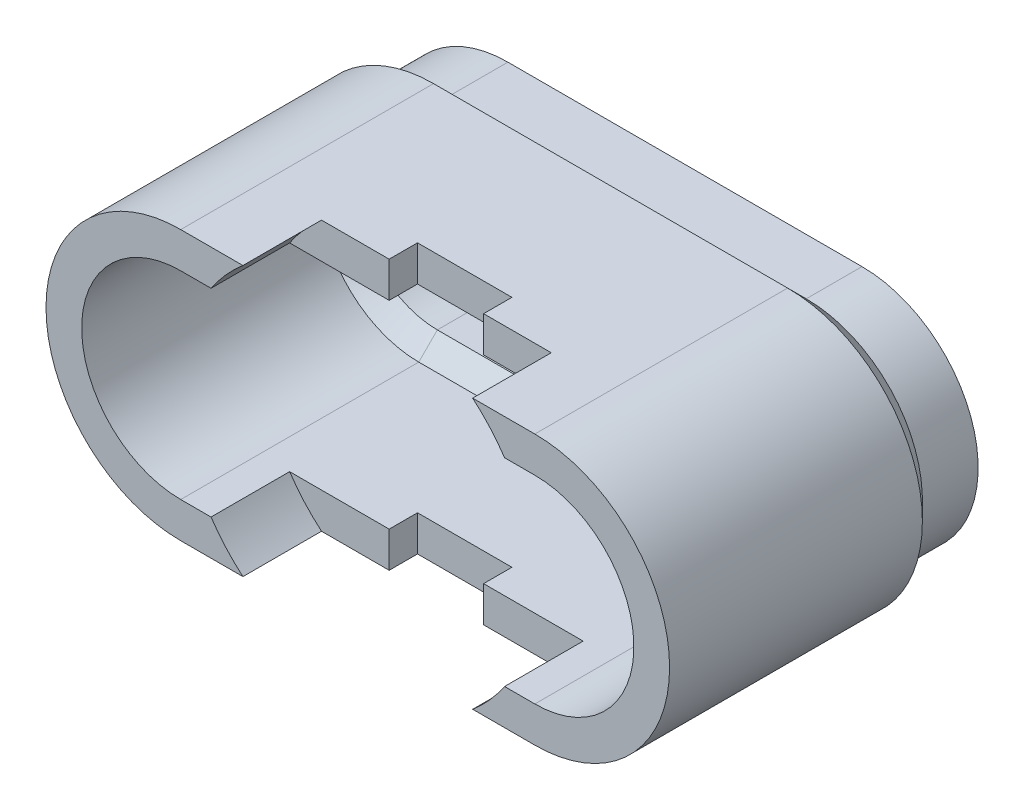
ISO-10303-21;
HEADER;
FILE_DESCRIPTION(('STEP AP214'),'2;1');
FILE_NAME('part.step','',(''),(''),'','','');
FILE_SCHEMA(('AUTOMOTIVE_DESIGN { 1 0 10303 214 1 1 1 1 }'));
ENDSEC;
DATA;
#1=APPLICATION_CONTEXT('core data for automotive mechanical design processes');
#2=APPLICATION_PROTOCOL_DEFINITION('international standard','automotive_design',2000,#1);
#3=PRODUCT_CONTEXT('',#1,'mechanical');
#4=PRODUCT('Part','Part','',(#3));
#5=PRODUCT_RELATED_PRODUCT_CATEGORY('part','',(#4));
#6=PRODUCT_DEFINITION_FORMATION('','',#4);
#7=PRODUCT_DEFINITION_CONTEXT('part definition',#1,'design');
#8=PRODUCT_DEFINITION('design','',#6,#7);
#9=PRODUCT_DEFINITION_SHAPE('','',#8);
#10=(LENGTH_UNIT() NAMED_UNIT(*) SI_UNIT(.MILLI.,.METRE.));
#11=(NAMED_UNIT(*) PLANE_ANGLE_UNIT() SI_UNIT($,.RADIAN.));
#12=(NAMED_UNIT(*) SI_UNIT($,.STERADIAN.) SOLID_ANGLE_UNIT());
#13=UNCERTAINTY_MEASURE_WITH_UNIT(LENGTH_MEASURE(1.E-05),#10,'distance_accuracy_value','');
#14=(GEOMETRIC_REPRESENTATION_CONTEXT(3) GLOBAL_UNCERTAINTY_ASSIGNED_CONTEXT((#13)) GLOBAL_UNIT_ASSIGNED_CONTEXT((#10,
#11,#12)) REPRESENTATION_CONTEXT('',''));
#15=CARTESIAN_POINT('',(0.,0.,0.));
#16=DIRECTION('',(0.,0.,1.));
#17=DIRECTION('',(1.,0.,0.));
#18=AXIS2_PLACEMENT_3D('',#15,#16,#17);
#19=CARTESIAN_POINT('',(0.,0.,5.18587753126935));
#20=DIRECTION('',(0.,0.,-1.));
#21=DIRECTION('',(-1.,0.,0.));
#22=AXIS2_PLACEMENT_3D('',#19,#20,#21);
#23=PLANE('',#22);
#24=DIRECTION('',(-1.,0.,0.));
#25=VECTOR('',#24,1.);
#26=CARTESIAN_POINT('',(-4.76249999999986,-3.6242,5.18587753126932));
#27=LINE('',#26,#25);
#28=CARTESIAN_POINT('',(-1.27000000000004,-3.6242,5.18587753126935));
#29=VERTEX_POINT('',#28);
#30=CARTESIAN_POINT('',(-3.08975413423138,-3.6242,5.18587753126933));
#31=VERTEX_POINT('',#30);
#32=EDGE_CURVE('E322',#29,#31,#27,.T.);
#33=ORIENTED_EDGE('',*,*,#32,.F.);
#34=DIRECTION('',(0.,-1.,0.));
#35=VECTOR('',#34,1.);
#36=CARTESIAN_POINT('',(-1.27000000000004,3.62419999999999,5.18587753126935));
#37=LINE('',#36,#35);
#38=CARTESIAN_POINT('',(-1.27000000000004,-2.6642,5.18587753126935));
#39=VERTEX_POINT('',#38);
#40=EDGE_CURVE('E258',#39,#29,#37,.T.);
#41=ORIENTED_EDGE('',*,*,#40,.F.);
#42=DIRECTION('',(-1.,0.,0.));
#43=VECTOR('',#42,1.);
#44=CARTESIAN_POINT('',(-4.76249999999986,-2.6642,5.18587753126932));
#45=LINE('',#44,#43);
#46=CARTESIAN_POINT('',(-3.94758718839747,-2.6642,5.18587753126932));
#47=VERTEX_POINT('',#46);
#48=EDGE_CURVE('E495',#39,#47,#45,.T.);
#49=ORIENTED_EDGE('',*,*,#48,.T.);
#50=CARTESIAN_POINT('',(0.,0.,5.18587753126935));
#51=DIRECTION('',(0.,0.,-1.));
#52=DIRECTION('',(-1.,0.,0.));
#53=AXIS2_PLACEMENT_3D('',#50,#51,#52);
#54=CIRCLE('',#53,4.7625);
#55=EDGE_CURVE('E305',#31,#47,#54,.T.);
#56=ORIENTED_EDGE('',*,*,#55,.F.);
#57=EDGE_LOOP('',(#33,#41,#49,#56));
#58=FACE_BOUND('',#57,.T.);
#59=ADVANCED_FACE('F33',(#58),#23,.F.);
#60=DIRECTION('',(1.,0.,0.));
#61=VECTOR('',#60,1.);
#62=CARTESIAN_POINT('',(4.76250000000014,2.6642,5.18587753126939));
#63=LINE('',#62,#61);
#64=CARTESIAN_POINT('',(-3.94758718839748,2.66419999999999,5.18587753126932));
#65=VERTEX_POINT('',#64);
#66=CARTESIAN_POINT('',(-1.27000000000004,2.66419999999999,5.18587753126935));
#67=VERTEX_POINT('',#66);
#68=EDGE_CURVE('E319',#65,#67,#63,.T.);
#69=ORIENTED_EDGE('',*,*,#68,.T.);
#70=CARTESIAN_POINT('',(-1.27000000000004,3.62419999999999,5.18587753126935));
#71=VERTEX_POINT('',#70);
#72=EDGE_CURVE('E273',#71,#67,#37,.T.);
#73=ORIENTED_EDGE('',*,*,#72,.F.);
#74=DIRECTION('',(1.,0.,0.));
#75=VECTOR('',#74,1.);
#76=CARTESIAN_POINT('',(4.76250000000014,3.6242,5.18587753126939));
#77=LINE('',#76,#75);
#78=CARTESIAN_POINT('',(-3.08975413423139,3.62419999999999,5.18587753126933));
#79=VERTEX_POINT('',#78);
#80=EDGE_CURVE('E326',#79,#71,#77,.T.);
#81=ORIENTED_EDGE('',*,*,#80,.F.);
#82=CARTESIAN_POINT('',(0.,0.,5.18587753126935));
#83=DIRECTION('',(0.,0.,-1.));
#84=DIRECTION('',(-1.,0.,0.));
#85=AXIS2_PLACEMENT_3D('',#82,#83,#84);
#86=CIRCLE('',#85,4.7625);
#87=EDGE_CURVE('E302',#65,#79,#86,.T.);
#88=ORIENTED_EDGE('',*,*,#87,.F.);
#89=EDGE_LOOP('',(#69,#73,#81,#88));
#90=FACE_BOUND('',#89,.T.);
#91=ADVANCED_FACE('F539',(#90),#23,.F.);
#92=CARTESIAN_POINT('',(0.,14.415499957,7.3));
#93=DIRECTION('',(0.,0.,-1.));
#94=DIRECTION('',(-1.,0.,0.));
#95=AXIS2_PLACEMENT_3D('',#92,#93,#94);
#96=PLANE('',#95);
#97=DIRECTION('',(1.,0.,0.));
#98=VECTOR('',#97,1.);
#99=CARTESIAN_POINT('',(4.76250000000013,2.6642,7.30000000000004));
#100=LINE('',#99,#98);
#101=CARTESIAN_POINT('',(-4.7625,2.6642,7.29999999999998));
#102=VERTEX_POINT('',#101);
#103=CARTESIAN_POINT('',(-3.94758718839749,2.6642,7.3));
#104=VERTEX_POINT('',#103);
#105=EDGE_CURVE('E403',#102,#104,#100,.T.);
#106=ORIENTED_EDGE('',*,*,#105,.T.);
#107=CARTESIAN_POINT('',(0.,0.,7.3));
#108=DIRECTION('',(0.,0.,1.));
#109=DIRECTION('',(1.,0.,0.));
#110=AXIS2_PLACEMENT_3D('',#107,#108,#109);
#111=CIRCLE('',#110,4.76250000000001);
#112=CARTESIAN_POINT('',(-3.0897541342314,3.6242,7.3));
#113=VERTEX_POINT('',#112);
#114=EDGE_CURVE('E298',#113,#104,#111,.T.);
#115=ORIENTED_EDGE('',*,*,#114,.F.);
#116=DIRECTION('',(1.,0.,0.));
#117=VECTOR('',#116,1.);
#118=CARTESIAN_POINT('',(4.76250000000013,3.6242,7.30000000000004));
#119=LINE('',#118,#117);
#120=CARTESIAN_POINT('',(-4.7625,3.6242,7.29999999999997));
#121=VERTEX_POINT('',#120);
#122=EDGE_CURVE('E419',#121,#113,#119,.T.);
#123=ORIENTED_EDGE('',*,*,#122,.F.);
#124=CARTESIAN_POINT('',(-4.7625,0.,7.29999999999997));
#125=DIRECTION('',(0.,0.,-1.));
#126=DIRECTION('',(-1.,0.,0.));
#127=AXIS2_PLACEMENT_3D('',#124,#125,#126);
#128=CIRCLE('',#127,3.6242);
#129=CARTESIAN_POINT('',(-4.7625,-3.6242,7.29999999999997));
#130=VERTEX_POINT('',#129);
#131=EDGE_CURVE('E423',#130,#121,#128,.T.);
#132=ORIENTED_EDGE('',*,*,#131,.F.);
#133=DIRECTION('',(-1.,0.,0.));
#134=VECTOR('',#133,1.);
#135=CARTESIAN_POINT('',(-4.76249999999987,-3.6242,7.29999999999997));
#136=LINE('',#135,#134);
#137=CARTESIAN_POINT('',(-3.08975413423138,-3.6242,7.3));
#138=VERTEX_POINT('',#137);
#139=EDGE_CURVE('E418',#138,#130,#136,.T.);
#140=ORIENTED_EDGE('',*,*,#139,.F.);
#141=CARTESIAN_POINT('',(0.,0.,7.3));
#142=DIRECTION('',(0.,0.,1.));
#143=DIRECTION('',(1.,0.,0.));
#144=AXIS2_PLACEMENT_3D('',#141,#142,#143);
#145=CIRCLE('',#144,4.7625);
#146=CARTESIAN_POINT('',(-3.94758718839748,-2.6642,7.3));
#147=VERTEX_POINT('',#146);
#148=EDGE_CURVE('E296',#147,#138,#145,.T.);
#149=ORIENTED_EDGE('',*,*,#148,.F.);
#150=DIRECTION('',(-1.,0.,0.));
#151=VECTOR('',#150,1.);
#152=CARTESIAN_POINT('',(-4.76249999999987,-2.6642,7.29999999999997));
#153=LINE('',#152,#151);
#154=CARTESIAN_POINT('',(-4.7625,-2.6642,7.29999999999997));
#155=VERTEX_POINT('',#154);
#156=EDGE_CURVE('E412',#147,#155,#153,.T.);
#157=ORIENTED_EDGE('',*,*,#156,.T.);
#158=CARTESIAN_POINT('',(-4.7625,0.,7.29999999999997));
#159=DIRECTION('',(0.,0.,-1.));
#160=DIRECTION('',(-1.,0.,0.));
#161=AXIS2_PLACEMENT_3D('',#158,#159,#160);
#162=CIRCLE('',#161,2.6642);
#163=EDGE_CURVE('E374',#155,#102,#162,.T.);
#164=ORIENTED_EDGE('',*,*,#163,.T.);
#165=EDGE_LOOP('',(#106,#115,#123,#132,#140,#149,#157,#164));
#166=FACE_BOUND('',#165,.T.);
#167=ADVANCED_FACE('F546',(#166),#96,.F.);
#168=CARTESIAN_POINT('',(-4.7625,0.,-18.4659261497862));
#169=DIRECTION('',(0.,0.,1.));
#170=DIRECTION('',(1.,0.,0.));
#171=AXIS2_PLACEMENT_3D('',#168,#169,#170);
#172=CYLINDRICAL_SURFACE('',#171,3.1242);
#173=CARTESIAN_POINT('',(-4.7625,0.,-1.5));
#174=DIRECTION('',(0.,0.,1.));
#175=DIRECTION('',(1.,0.,0.));
#176=AXIS2_PLACEMENT_3D('',#173,#174,#175);
#177=CIRCLE('',#176,3.1242);
#178=CARTESIAN_POINT('',(-4.7625,-3.1242,-1.5));
#179=VERTEX_POINT('',#178);
#180=CARTESIAN_POINT('',(-4.7625,3.1242,-1.5));
#181=VERTEX_POINT('',#180);
#182=EDGE_CURVE('E470',#179,#181,#177,.F.);
#183=ORIENTED_EDGE('',*,*,#182,.F.);
#184=DIRECTION('',(0.,0.,1.));
#185=VECTOR('',#184,1.);
#186=CARTESIAN_POINT('',(-4.7625,-3.1242,-18.4659261497862));
#187=LINE('',#186,#185);
#188=CARTESIAN_POINT('',(-4.7625,-3.1242,0.));
#189=VERTEX_POINT('',#188);
#190=EDGE_CURVE('E484',#179,#189,#187,.T.);
#191=ORIENTED_EDGE('',*,*,#190,.T.);
#192=CARTESIAN_POINT('',(-4.7625,0.,0.));
#193=DIRECTION('',(0.,0.,1.));
#194=DIRECTION('',(1.,0.,0.));
#195=AXIS2_PLACEMENT_3D('',#192,#193,#194);
#196=CIRCLE('',#195,3.1242);
#197=CARTESIAN_POINT('',(-4.7625,3.1242,0.));
#198=VERTEX_POINT('',#197);
#199=EDGE_CURVE('E456',#198,#189,#196,.T.);
#200=ORIENTED_EDGE('',*,*,#199,.F.);
#201=DIRECTION('',(0.,0.,1.));
#202=VECTOR('',#201,1.);
#203=CARTESIAN_POINT('',(-4.7625,3.1242,-18.4659261497862));
#204=LINE('',#203,#202);
#205=EDGE_CURVE('E468',#181,#198,#204,.T.);
#206=ORIENTED_EDGE('',*,*,#205,.F.);
#207=EDGE_LOOP('',(#183,#191,#200,#206));
#208=FACE_BOUND('',#207,.T.);
#209=ADVANCED_FACE('F35',(#208),#172,.T.);
#210=CARTESIAN_POINT('',(4.7625,3.1242,-18.4659261497862));
#211=DIRECTION('',(0.,1.,0.));
#212=DIRECTION('',(-1.,0.,0.));
#213=AXIS2_PLACEMENT_3D('',#210,#211,#212);
#214=PLANE('',#213);
#215=DIRECTION('',(1.,0.,0.));
#216=VECTOR('',#215,1.);
#217=CARTESIAN_POINT('',(4.7625,3.1242,-1.5));
#218=LINE('',#217,#216);
#219=CARTESIAN_POINT('',(4.7625,3.1242,-1.5));
#220=VERTEX_POINT('',#219);
#221=EDGE_CURVE('E467',#181,#220,#218,.T.);
#222=ORIENTED_EDGE('',*,*,#221,.F.);
#223=ORIENTED_EDGE('',*,*,#205,.T.);
#224=DIRECTION('',(-1.,0.,0.));
#225=VECTOR('',#224,1.);
#226=CARTESIAN_POINT('',(4.7625,3.1242,0.));
#227=LINE('',#226,#225);
#228=CARTESIAN_POINT('',(4.7625,3.1242,0.));
#229=VERTEX_POINT('',#228);
#230=EDGE_CURVE('E481',#229,#198,#227,.T.);
#231=ORIENTED_EDGE('',*,*,#230,.F.);
#232=DIRECTION('',(0.,0.,1.));
#233=VECTOR('',#232,1.);
#234=CARTESIAN_POINT('',(4.7625,3.1242,-18.4659261497862));
#235=LINE('',#234,#233);
#236=EDGE_CURVE('E487',#220,#229,#235,.T.);
#237=ORIENTED_EDGE('',*,*,#236,.F.);
#238=EDGE_LOOP('',(#222,#223,#231,#237));
#239=FACE_BOUND('',#238,.T.);
#240=ADVANCED_FACE('F909',(#239),#214,.T.);
#241=CARTESIAN_POINT('',(4.7625,0.,-18.4659261497862));
#242=DIRECTION('',(0.,0.,1.));
#243=DIRECTION('',(1.,0.,0.));
#244=AXIS2_PLACEMENT_3D('',#241,#242,#243);
#245=CYLINDRICAL_SURFACE('',#244,3.1242);
#246=CARTESIAN_POINT('',(4.7625,0.,-1.5));
#247=DIRECTION('',(0.,0.,1.));
#248=DIRECTION('',(1.,0.,0.));
#249=AXIS2_PLACEMENT_3D('',#246,#247,#248);
#250=CIRCLE('',#249,3.1242);
#251=CARTESIAN_POINT('',(4.7625,-3.1242,-1.5));
#252=VERTEX_POINT('',#251);
#253=EDGE_CURVE('E465',#220,#252,#250,.F.);
#254=ORIENTED_EDGE('',*,*,#253,.F.);
#255=ORIENTED_EDGE('',*,*,#236,.T.);
#256=CARTESIAN_POINT('',(4.7625,0.,0.));
#257=DIRECTION('',(0.,0.,1.));
#258=DIRECTION('',(1.,0.,0.));
#259=AXIS2_PLACEMENT_3D('',#256,#257,#258);
#260=CIRCLE('',#259,3.1242);
#261=CARTESIAN_POINT('',(4.7625,-3.1242,0.));
#262=VERTEX_POINT('',#261);
#263=EDGE_CURVE('E478',#262,#229,#260,.T.);
#264=ORIENTED_EDGE('',*,*,#263,.F.);
#265=DIRECTION('',(0.,0.,1.));
#266=VECTOR('',#265,1.);
#267=CARTESIAN_POINT('',(4.7625,-3.1242,-18.4659261497862));
#268=LINE('',#267,#266);
#269=EDGE_CURVE('E489',#252,#262,#268,.T.);
#270=ORIENTED_EDGE('',*,*,#269,.F.);
#271=EDGE_LOOP('',(#254,#255,#264,#270));
#272=FACE_BOUND('',#271,.T.);
#273=ADVANCED_FACE('F901',(#272),#245,.T.);
#274=CARTESIAN_POINT('',(-4.7625,-3.1242,-18.4659261497862));
#275=DIRECTION('',(0.,-1.,0.));
#276=DIRECTION('',(0.,0.,-1.));
#277=AXIS2_PLACEMENT_3D('',#274,#275,#276);
#278=PLANE('',#277);
#279=DIRECTION('',(-1.,0.,0.));
#280=VECTOR('',#279,1.);
#281=CARTESIAN_POINT('',(-4.7625,-3.1242,-1.5));
#282=LINE('',#281,#280);
#283=EDGE_CURVE('E472',#252,#179,#282,.T.);
#284=ORIENTED_EDGE('',*,*,#283,.F.);
#285=ORIENTED_EDGE('',*,*,#269,.T.);
#286=DIRECTION('',(1.,0.,0.));
#287=VECTOR('',#286,1.);
#288=CARTESIAN_POINT('',(-4.7625,-3.1242,0.));
#289=LINE('',#288,#287);
#290=EDGE_CURVE('E475',#189,#262,#289,.T.);
#291=ORIENTED_EDGE('',*,*,#290,.F.);
#292=ORIENTED_EDGE('',*,*,#190,.F.);
#293=EDGE_LOOP('',(#284,#285,#291,#292));
#294=FACE_BOUND('',#293,.T.);
#295=ADVANCED_FACE('F892',(#294),#278,.T.);
#296=CARTESIAN_POINT('',(0.,14.415499957,-1.5));
#297=DIRECTION('',(0.,0.,1.));
#298=DIRECTION('',(1.,0.,0.));
#299=AXIS2_PLACEMENT_3D('',#296,#297,#298);
#300=PLANE('',#299);
#301=ORIENTED_EDGE('',*,*,#182,.T.);
#302=ORIENTED_EDGE('',*,*,#221,.T.);
#303=ORIENTED_EDGE('',*,*,#253,.T.);
#304=ORIENTED_EDGE('',*,*,#283,.T.);
#305=EDGE_LOOP('',(#301,#302,#303,#304));
#306=FACE_BOUND('',#305,.T.);
#307=ADVANCED_FACE('F882',(#306),#300,.F.);
#308=CARTESIAN_POINT('',(-4.7625,0.,0.));
#309=DIRECTION('',(0.,0.,1.));
#310=DIRECTION('',(1.,0.,0.));
#311=AXIS2_PLACEMENT_3D('',#308,#309,#310);
#312=CONICAL_SURFACE('',#311,3.1242,0.78539816339745);
#313=ORIENTED_EDGE('',*,*,#199,.T.);
#314=DIRECTION('',(0.,-0.707106781186549,0.707106781186546));
#315=VECTOR('',#314,1.);
#316=CARTESIAN_POINT('',(-4.7625,-3.1242,0.));
#317=LINE('',#316,#315);
#318=CARTESIAN_POINT('',(-4.7625,-3.6242,0.5));
#319=VERTEX_POINT('',#318);
#320=EDGE_CURVE('E453',#319,#189,#317,.F.);
#321=ORIENTED_EDGE('',*,*,#320,.F.);
#322=CARTESIAN_POINT('',(-4.7625,0.,0.5));
#323=DIRECTION('',(0.,0.,1.));
#324=DIRECTION('',(1.,0.,0.));
#325=AXIS2_PLACEMENT_3D('',#322,#323,#324);
#326=CIRCLE('',#325,3.6242);
#327=CARTESIAN_POINT('',(-4.7625,3.6242,0.5));
#328=VERTEX_POINT('',#327);
#329=EDGE_CURVE('E426',#328,#319,#326,.T.);
#330=ORIENTED_EDGE('',*,*,#329,.F.);
#331=DIRECTION('',(0.,0.707106781186549,0.707106781186546));
#332=VECTOR('',#331,1.);
#333=CARTESIAN_POINT('',(-4.7625,3.1242,0.));
#334=LINE('',#333,#332);
#335=EDGE_CURVE('E452',#328,#198,#334,.F.);
#336=ORIENTED_EDGE('',*,*,#335,.T.);
#337=EDGE_LOOP('',(#313,#321,#330,#336));
#338=FACE_BOUND('',#337,.T.);
#339=ADVANCED_FACE('F873',(#338),#312,.T.);
#340=CARTESIAN_POINT('',(-4.7625,-3.1242,0.));
#341=DIRECTION('',(0.,-0.707106781186546,-0.707106781186549));
#342=DIRECTION('',(0.,0.707106781186549,-0.707106781186546));
#343=AXIS2_PLACEMENT_3D('',#340,#341,#342);
#344=PLANE('',#343);
#345=ORIENTED_EDGE('',*,*,#290,.T.);
#346=DIRECTION('',(0.,-0.707106781186549,0.707106781186546));
#347=VECTOR('',#346,1.);
#348=CARTESIAN_POINT('',(4.7625,-3.1242,0.));
#349=LINE('',#348,#347);
#350=CARTESIAN_POINT('',(4.7625,-3.6242,0.5));
#351=VERTEX_POINT('',#350);
#352=EDGE_CURVE('E457',#351,#262,#349,.F.);
#353=ORIENTED_EDGE('',*,*,#352,.F.);
#354=DIRECTION('',(-1.,0.,0.));
#355=VECTOR('',#354,1.);
#356=CARTESIAN_POINT('',(-4.7625,-3.6242,0.5));
#357=LINE('',#356,#355);
#358=EDGE_CURVE('E443',#319,#351,#357,.F.);
#359=ORIENTED_EDGE('',*,*,#358,.F.);
#360=ORIENTED_EDGE('',*,*,#320,.T.);
#361=EDGE_LOOP('',(#345,#353,#359,#360));
#362=FACE_BOUND('',#361,.T.);
#363=ADVANCED_FACE('F864',(#362),#344,.T.);
#364=CARTESIAN_POINT('',(4.7625,0.,0.));
#365=DIRECTION('',(0.,0.,1.));
#366=DIRECTION('',(1.,0.,0.));
#367=AXIS2_PLACEMENT_3D('',#364,#365,#366);
#368=CONICAL_SURFACE('',#367,3.1242,0.78539816339745);
#369=ORIENTED_EDGE('',*,*,#263,.T.);
#370=DIRECTION('',(0.,0.707106781186549,0.707106781186546));
#371=VECTOR('',#370,1.);
#372=CARTESIAN_POINT('',(4.7625,3.1242,0.));
#373=LINE('',#372,#371);
#374=CARTESIAN_POINT('',(4.7625,3.6242,0.5));
#375=VERTEX_POINT('',#374);
#376=EDGE_CURVE('E460',#375,#229,#373,.F.);
#377=ORIENTED_EDGE('',*,*,#376,.F.);
#378=CARTESIAN_POINT('',(4.7625,0.,0.5));
#379=DIRECTION('',(0.,0.,1.));
#380=DIRECTION('',(1.,0.,0.));
#381=AXIS2_PLACEMENT_3D('',#378,#379,#380);
#382=CIRCLE('',#381,3.6242);
#383=EDGE_CURVE('E446',#351,#375,#382,.T.);
#384=ORIENTED_EDGE('',*,*,#383,.F.);
#385=ORIENTED_EDGE('',*,*,#352,.T.);
#386=EDGE_LOOP('',(#369,#377,#384,#385));
#387=FACE_BOUND('',#386,.T.);
#388=ADVANCED_FACE('F855',(#387),#368,.T.);
#389=CARTESIAN_POINT('',(4.7625,3.1242,0.));
#390=DIRECTION('',(0.,0.707106781186546,-0.707106781186549));
#391=DIRECTION('',(0.,0.707106781186549,0.707106781186546));
#392=AXIS2_PLACEMENT_3D('',#389,#390,#391);
#393=PLANE('',#392);
#394=ORIENTED_EDGE('',*,*,#230,.T.);
#395=ORIENTED_EDGE('',*,*,#335,.F.);
#396=DIRECTION('',(1.,0.,0.));
#397=VECTOR('',#396,1.);
#398=CARTESIAN_POINT('',(4.7625,3.6242,0.5));
#399=LINE('',#398,#397);
#400=EDGE_CURVE('E449',#375,#328,#399,.F.);
#401=ORIENTED_EDGE('',*,*,#400,.F.);
#402=ORIENTED_EDGE('',*,*,#376,.T.);
#403=EDGE_LOOP('',(#394,#395,#401,#402));
#404=FACE_BOUND('',#403,.T.);
#405=ADVANCED_FACE('F848',(#404),#393,.T.);
#406=CARTESIAN_POINT('',(4.7625,3.6242,25.572554559229));
#407=DIRECTION('',(0.,-1.,0.));
#408=DIRECTION('',(1.,0.,0.));
#409=AXIS2_PLACEMENT_3D('',#406,#407,#408);
#410=PLANE('',#409);
#411=ORIENTED_EDGE('',*,*,#80,.T.);
#412=DIRECTION('',(0.,0.,1.));
#413=VECTOR('',#412,1.);
#414=CARTESIAN_POINT('',(-1.27000000000004,3.62419999999999,4.42387753126935));
#415=LINE('',#414,#413);
#416=CARTESIAN_POINT('',(-1.27000000000004,3.62419999999999,4.42387753126935));
#417=VERTEX_POINT('',#416);
#418=EDGE_CURVE('E276',#417,#71,#415,.T.);
#419=ORIENTED_EDGE('',*,*,#418,.F.);
#420=DIRECTION('',(-1.,0.,0.));
#421=VECTOR('',#420,1.);
#422=CARTESIAN_POINT('',(-1.27000000000004,3.62419999999999,4.42387753126935));
#423=LINE('',#422,#421);
#424=CARTESIAN_POINT('',(1.26999999999996,3.62419999999999,4.42387753126935));
#425=VERTEX_POINT('',#424);
#426=EDGE_CURVE('E261',#425,#417,#423,.T.);
#427=ORIENTED_EDGE('',*,*,#426,.F.);
#428=DIRECTION('',(0.,0.,1.));
#429=VECTOR('',#428,1.);
#430=CARTESIAN_POINT('',(1.26999999999996,3.62419999999999,4.42387753126935));
#431=LINE('',#430,#429);
#432=CARTESIAN_POINT('',(1.26999999999996,3.62419999999999,5.18587753126935));
#433=VERTEX_POINT('',#432);
#434=EDGE_CURVE('E279',#425,#433,#431,.T.);
#435=ORIENTED_EDGE('',*,*,#434,.T.);
#436=CARTESIAN_POINT('',(3.08975413423142,3.6242,5.18587753126937));
#437=VERTEX_POINT('',#436);
#438=EDGE_CURVE('E325',#433,#437,#77,.T.);
#439=ORIENTED_EDGE('',*,*,#438,.T.);
#440=DIRECTION('',(0.,0.,1.));
#441=VECTOR('',#440,1.);
#442=CARTESIAN_POINT('',(3.08975413423142,3.6242,-7.74569128307022));
#443=LINE('',#442,#441);
#444=CARTESIAN_POINT('',(3.08975413423142,3.6242,7.3));
#445=VERTEX_POINT('',#444);
#446=EDGE_CURVE('E329',#437,#445,#443,.T.);
#447=ORIENTED_EDGE('',*,*,#446,.T.);
#448=CARTESIAN_POINT('',(4.7625,3.6242,7.30000000000001));
#449=VERTEX_POINT('',#448);
#450=EDGE_CURVE('E438',#445,#449,#119,.T.);
#451=ORIENTED_EDGE('',*,*,#450,.T.);
#452=DIRECTION('',(0.,0.,-1.));
#453=VECTOR('',#452,1.);
#454=CARTESIAN_POINT('',(4.7625,3.6242,25.572554559229));
#455=LINE('',#454,#453);
#456=EDGE_CURVE('E429',#449,#375,#455,.T.);
#457=ORIENTED_EDGE('',*,*,#456,.T.);
#458=ORIENTED_EDGE('',*,*,#400,.T.);
#459=DIRECTION('',(0.,0.,-1.));
#460=VECTOR('',#459,1.);
#461=CARTESIAN_POINT('',(-4.7625,3.6242,25.572554559229));
#462=LINE('',#461,#460);
#463=EDGE_CURVE('E364',#121,#328,#462,.T.);
#464=ORIENTED_EDGE('',*,*,#463,.F.);
#465=ORIENTED_EDGE('',*,*,#122,.T.);
#466=DIRECTION('',(0.,0.,1.));
#467=VECTOR('',#466,1.);
#468=CARTESIAN_POINT('',(-3.0897541342314,3.6242,-7.74569128307022));
#469=LINE('',#468,#467);
#470=EDGE_CURVE('E332',#113,#79,#469,.F.);
#471=ORIENTED_EDGE('',*,*,#470,.T.);
#472=EDGE_LOOP('',(#411,#419,#427,#435,#439,#447,#451,#457,#458,#464,#465,#471));
#473=FACE_BOUND('',#472,.T.);
#474=ADVANCED_FACE('F527',(#473),#410,.F.);
#475=CARTESIAN_POINT('',(4.7625,0.,25.572554559229));
#476=DIRECTION('',(0.,0.,-1.));
#477=DIRECTION('',(-1.,0.,0.));
#478=AXIS2_PLACEMENT_3D('',#475,#476,#477);
#479=CYLINDRICAL_SURFACE('',#478,3.6242);
#480=ORIENTED_EDGE('',*,*,#456,.F.);
#481=CARTESIAN_POINT('',(4.7625,0.,7.30000000000004));
#482=DIRECTION('',(0.,0.,-1.));
#483=DIRECTION('',(-1.,0.,0.));
#484=AXIS2_PLACEMENT_3D('',#481,#482,#483);
#485=CIRCLE('',#484,3.6242);
#486=CARTESIAN_POINT('',(4.76249999999999,-3.6242,7.30000000000004));
#487=VERTEX_POINT('',#486);
#488=EDGE_CURVE('E415',#449,#487,#485,.T.);
#489=ORIENTED_EDGE('',*,*,#488,.T.);
#490=DIRECTION('',(0.,0.,-1.));
#491=VECTOR('',#490,1.);
#492=CARTESIAN_POINT('',(4.76249999999999,-3.6242,25.572554559229));
#493=LINE('',#492,#491);
#494=EDGE_CURVE('E432',#487,#351,#493,.T.);
#495=ORIENTED_EDGE('',*,*,#494,.T.);
#496=ORIENTED_EDGE('',*,*,#383,.T.);
#497=EDGE_LOOP('',(#480,#489,#495,#496));
#498=FACE_BOUND('',#497,.T.);
#499=ADVANCED_FACE('F833',(#498),#479,.T.);
#500=CARTESIAN_POINT('',(-4.7625,-3.6242,25.572554559229));
#501=DIRECTION('',(0.,1.,0.));
#502=DIRECTION('',(-1.,0.,0.));
#503=AXIS2_PLACEMENT_3D('',#500,#501,#502);
#504=PLANE('',#503);
#505=DIRECTION('',(1.,0.,0.));
#506=VECTOR('',#505,1.);
#507=CARTESIAN_POINT('',(-1.27000000000004,-3.6242,4.42387753126935));
#508=LINE('',#507,#506);
#509=CARTESIAN_POINT('',(-1.27000000000004,-3.6242,4.42387753126935));
#510=VERTEX_POINT('',#509);
#511=CARTESIAN_POINT('',(1.26999999999996,-3.6242,4.42387753126935));
#512=VERTEX_POINT('',#511);
#513=EDGE_CURVE('E248',#510,#512,#508,.T.);
#514=ORIENTED_EDGE('',*,*,#513,.F.);
#515=DIRECTION('',(0.,0.,1.));
#516=VECTOR('',#515,1.);
#517=CARTESIAN_POINT('',(-1.27000000000004,-3.6242,4.42387753126935));
#518=LINE('',#517,#516);
#519=EDGE_CURVE('E255',#510,#29,#518,.T.);
#520=ORIENTED_EDGE('',*,*,#519,.T.);
#521=ORIENTED_EDGE('',*,*,#32,.T.);
#522=DIRECTION('',(0.,0.,1.));
#523=VECTOR('',#522,1.);
#524=CARTESIAN_POINT('',(-3.08975413423138,-3.6242,-7.74569128307022));
#525=LINE('',#524,#523);
#526=EDGE_CURVE('E315',#31,#138,#525,.T.);
#527=ORIENTED_EDGE('',*,*,#526,.T.);
#528=ORIENTED_EDGE('',*,*,#139,.T.);
#529=DIRECTION('',(0.,0.,-1.));
#530=VECTOR('',#529,1.);
#531=CARTESIAN_POINT('',(-4.7625,-3.6242,25.572554559229));
#532=LINE('',#531,#530);
#533=EDGE_CURVE('E435',#130,#319,#532,.T.);
#534=ORIENTED_EDGE('',*,*,#533,.T.);
#535=ORIENTED_EDGE('',*,*,#358,.T.);
#536=ORIENTED_EDGE('',*,*,#494,.F.);
#537=CARTESIAN_POINT('',(3.08975413423142,-3.6242,7.3));
#538=VERTEX_POINT('',#537);
#539=EDGE_CURVE('E420',#487,#538,#136,.T.);
#540=ORIENTED_EDGE('',*,*,#539,.T.);
#541=DIRECTION('',(0.,0.,1.));
#542=VECTOR('',#541,1.);
#543=CARTESIAN_POINT('',(3.08975413423143,-3.6242,-7.74569128307022));
#544=LINE('',#543,#542);
#545=CARTESIAN_POINT('',(3.08975413423143,-3.6242,5.18587753126937));
#546=VERTEX_POINT('',#545);
#547=EDGE_CURVE('E295',#538,#546,#544,.F.);
#548=ORIENTED_EDGE('',*,*,#547,.T.);
#549=CARTESIAN_POINT('',(1.26999999999996,-3.6242,5.18587753126936));
#550=VERTEX_POINT('',#549);
#551=EDGE_CURVE('E323',#546,#550,#27,.T.);
#552=ORIENTED_EDGE('',*,*,#551,.T.);
#553=DIRECTION('',(0.,0.,1.));
#554=VECTOR('',#553,1.);
#555=CARTESIAN_POINT('',(1.26999999999996,-3.6242,4.42387753126935));
#556=LINE('',#555,#554);
#557=EDGE_CURVE('E48',#512,#550,#556,.T.);
#558=ORIENTED_EDGE('',*,*,#557,.F.);
#559=EDGE_LOOP('',(#514,#520,#521,#527,#528,#534,#535,#536,#540,#548,#552,#558));
#560=FACE_BOUND('',#559,.T.);
#561=ADVANCED_FACE('F263',(#560),#504,.F.);
#562=CARTESIAN_POINT('',(-4.7625,0.,25.572554559229));
#563=DIRECTION('',(0.,0.,-1.));
#564=DIRECTION('',(-1.,0.,0.));
#565=AXIS2_PLACEMENT_3D('',#562,#563,#564);
#566=CYLINDRICAL_SURFACE('',#565,3.6242);
#567=ORIENTED_EDGE('',*,*,#533,.F.);
#568=ORIENTED_EDGE('',*,*,#131,.T.);
#569=ORIENTED_EDGE('',*,*,#463,.T.);
#570=ORIENTED_EDGE('',*,*,#329,.T.);
#571=EDGE_LOOP('',(#567,#568,#569,#570));
#572=FACE_BOUND('',#571,.T.);
#573=ADVANCED_FACE('F550',(#572),#566,.T.);
#574=CARTESIAN_POINT('',(4.7625,-2.6642,7.30000000000004));
#575=VERTEX_POINT('',#574);
#576=CARTESIAN_POINT('',(3.94758718839751,-2.6642,7.30000000000003));
#577=VERTEX_POINT('',#576);
#578=EDGE_CURVE('E409',#575,#577,#153,.T.);
#579=ORIENTED_EDGE('',*,*,#578,.T.);
#580=CARTESIAN_POINT('',(0.,0.,7.3));
#581=DIRECTION('',(0.,0.,1.));
#582=DIRECTION('',(1.,0.,0.));
#583=AXIS2_PLACEMENT_3D('',#580,#581,#582);
#584=CIRCLE('',#583,4.76250000000001);
#585=EDGE_CURVE('E293',#538,#577,#584,.T.);
#586=ORIENTED_EDGE('',*,*,#585,.F.);
#587=ORIENTED_EDGE('',*,*,#539,.F.);
#588=ORIENTED_EDGE('',*,*,#488,.F.);
#589=ORIENTED_EDGE('',*,*,#450,.F.);
#590=CARTESIAN_POINT('',(0.,0.,7.3));
#591=DIRECTION('',(0.,0.,1.));
#592=DIRECTION('',(1.,0.,0.));
#593=AXIS2_PLACEMENT_3D('',#590,#591,#592);
#594=CIRCLE('',#593,4.7625);
#595=CARTESIAN_POINT('',(3.94758718839751,2.6642,7.3));
#596=VERTEX_POINT('',#595);
#597=EDGE_CURVE('E300',#596,#445,#594,.T.);
#598=ORIENTED_EDGE('',*,*,#597,.F.);
#599=CARTESIAN_POINT('',(4.7625,2.6642,7.30000000000001));
#600=VERTEX_POINT('',#599);
#601=EDGE_CURVE('E402',#596,#600,#100,.T.);
#602=ORIENTED_EDGE('',*,*,#601,.T.);
#603=CARTESIAN_POINT('',(4.7625,0.,7.30000000000004));
#604=DIRECTION('',(0.,0.,-1.));
#605=DIRECTION('',(-1.,0.,0.));
#606=AXIS2_PLACEMENT_3D('',#603,#604,#605);
#607=CIRCLE('',#606,2.6642);
#608=EDGE_CURVE('E406',#600,#575,#607,.T.);
#609=ORIENTED_EDGE('',*,*,#608,.T.);
#610=EDGE_LOOP('',(#579,#586,#587,#588,#589,#598,#602,#609));
#611=FACE_BOUND('',#610,.T.);
#612=ADVANCED_FACE('F522',(#611),#96,.F.);
#613=CARTESIAN_POINT('',(-4.7625,0.,-18.4659261497862));
#614=DIRECTION('',(0.,0.,1.));
#615=DIRECTION('',(1.,0.,0.));
#616=AXIS2_PLACEMENT_3D('',#613,#614,#615);
#617=CYLINDRICAL_SURFACE('',#616,2.1642);
#618=CARTESIAN_POINT('',(-4.7625,0.,-1.));
#619=DIRECTION('',(0.,0.,1.));
#620=DIRECTION('',(1.,0.,0.));
#621=AXIS2_PLACEMENT_3D('',#618,#619,#620);
#622=CIRCLE('',#621,2.1642);
#623=CARTESIAN_POINT('',(-4.7625,-2.1642,-1.));
#624=VERTEX_POINT('',#623);
#625=CARTESIAN_POINT('',(-4.7625,2.1642,-1.));
#626=VERTEX_POINT('',#625);
#627=EDGE_CURVE('E336',#624,#626,#622,.F.);
#628=ORIENTED_EDGE('',*,*,#627,.T.);
#629=DIRECTION('',(0.,0.,1.));
#630=VECTOR('',#629,1.);
#631=CARTESIAN_POINT('',(-4.7625,2.1642,-18.4659261497862));
#632=LINE('',#631,#630);
#633=CARTESIAN_POINT('',(-4.7625,2.1642,0.397645019878173));
#634=VERTEX_POINT('',#633);
#635=EDGE_CURVE('E349',#626,#634,#632,.T.);
#636=ORIENTED_EDGE('',*,*,#635,.T.);
#637=CARTESIAN_POINT('',(-4.7625,0.,0.397645019878172));
#638=DIRECTION('',(0.,0.,1.));
#639=DIRECTION('',(1.,0.,0.));
#640=AXIS2_PLACEMENT_3D('',#637,#638,#639);
#641=CIRCLE('',#640,2.1642);
#642=CARTESIAN_POINT('',(-4.7625,-2.1642,0.397645019878172));
#643=VERTEX_POINT('',#642);
#644=EDGE_CURVE('E344',#634,#643,#641,.T.);
#645=ORIENTED_EDGE('',*,*,#644,.T.);
#646=DIRECTION('',(0.,0.,1.));
#647=VECTOR('',#646,1.);
#648=CARTESIAN_POINT('',(-4.7625,-2.1642,-18.4659261497862));
#649=LINE('',#648,#647);
#650=EDGE_CURVE('E340',#624,#643,#649,.T.);
#651=ORIENTED_EDGE('',*,*,#650,.F.);
#652=EDGE_LOOP('',(#628,#636,#645,#651));
#653=FACE_BOUND('',#652,.T.);
#654=ADVANCED_FACE('F591',(#653),#617,.F.);
#655=CARTESIAN_POINT('',(4.7625,2.1642,-18.4659261497862));
#656=DIRECTION('',(0.,1.,0.));
#657=DIRECTION('',(-1.,0.,0.));
#658=AXIS2_PLACEMENT_3D('',#655,#656,#657);
#659=PLANE('',#658);
#660=DIRECTION('',(1.,0.,0.));
#661=VECTOR('',#660,1.);
#662=CARTESIAN_POINT('',(4.7625,2.1642,-1.));
#663=LINE('',#662,#661);
#664=CARTESIAN_POINT('',(4.7625,2.1642,-1.));
#665=VERTEX_POINT('',#664);
#666=EDGE_CURVE('E339',#626,#665,#663,.T.);
#667=ORIENTED_EDGE('',*,*,#666,.T.);
#668=DIRECTION('',(0.,0.,1.));
#669=VECTOR('',#668,1.);
#670=CARTESIAN_POINT('',(4.7625,2.1642,-18.4659261497862));
#671=LINE('',#670,#669);
#672=CARTESIAN_POINT('',(4.7625,2.1642,0.397645019878172));
#673=VERTEX_POINT('',#672);
#674=EDGE_CURVE('E353',#665,#673,#671,.T.);
#675=ORIENTED_EDGE('',*,*,#674,.T.);
#676=DIRECTION('',(1.,0.,0.));
#677=VECTOR('',#676,1.);
#678=CARTESIAN_POINT('',(4.7625,2.1642,0.397645019878172));
#679=LINE('',#678,#677);
#680=EDGE_CURVE('E343',#673,#634,#679,.F.);
#681=ORIENTED_EDGE('',*,*,#680,.T.);
#682=ORIENTED_EDGE('',*,*,#635,.F.);
#683=EDGE_LOOP('',(#667,#675,#681,#682));
#684=FACE_BOUND('',#683,.T.);
#685=ADVANCED_FACE('F595',(#684),#659,.F.);
#686=CARTESIAN_POINT('',(4.7625,0.,-18.4659261497862));
#687=DIRECTION('',(0.,0.,1.));
#688=DIRECTION('',(1.,0.,0.));
#689=AXIS2_PLACEMENT_3D('',#686,#687,#688);
#690=CYLINDRICAL_SURFACE('',#689,2.1642);
#691=CARTESIAN_POINT('',(4.7625,0.,-1.));
#692=DIRECTION('',(0.,0.,1.));
#693=DIRECTION('',(1.,0.,0.));
#694=AXIS2_PLACEMENT_3D('',#691,#692,#693);
#695=CIRCLE('',#694,2.1642);
#696=CARTESIAN_POINT('',(4.7625,-2.1642,-1.));
#697=VERTEX_POINT('',#696);
#698=EDGE_CURVE('E352',#665,#697,#695,.F.);
#699=ORIENTED_EDGE('',*,*,#698,.T.);
#700=DIRECTION('',(0.,0.,-1.));
#701=VECTOR('',#700,1.);
#702=CARTESIAN_POINT('',(4.7625,-2.1642,-18.4659261497862));
#703=LINE('',#702,#701);
#704=CARTESIAN_POINT('',(4.7625,-2.1642,0.397645019878173));
#705=VERTEX_POINT('',#704);
#706=EDGE_CURVE('E342',#697,#705,#703,.F.);
#707=ORIENTED_EDGE('',*,*,#706,.T.);
#708=CARTESIAN_POINT('',(4.7625,0.,0.397645019878172));
#709=DIRECTION('',(0.,0.,1.));
#710=DIRECTION('',(1.,0.,0.));
#711=AXIS2_PLACEMENT_3D('',#708,#709,#710);
#712=CIRCLE('',#711,2.1642);
#713=EDGE_CURVE('E357',#705,#673,#712,.T.);
#714=ORIENTED_EDGE('',*,*,#713,.T.);
#715=ORIENTED_EDGE('',*,*,#674,.F.);
#716=EDGE_LOOP('',(#699,#707,#714,#715));
#717=FACE_BOUND('',#716,.T.);
#718=ADVANCED_FACE('F599',(#717),#690,.F.);
#719=CARTESIAN_POINT('',(-4.7625,-2.1642,-18.4659261497862));
#720=DIRECTION('',(0.,-1.,0.));
#721=DIRECTION('',(0.,0.,-1.));
#722=AXIS2_PLACEMENT_3D('',#719,#720,#721);
#723=PLANE('',#722);
#724=DIRECTION('',(-1.,0.,0.));
#725=VECTOR('',#724,1.);
#726=CARTESIAN_POINT('',(-4.7625,-2.1642,-1.));
#727=LINE('',#726,#725);
#728=EDGE_CURVE('E338',#697,#624,#727,.T.);
#729=ORIENTED_EDGE('',*,*,#728,.T.);
#730=ORIENTED_EDGE('',*,*,#650,.T.);
#731=DIRECTION('',(-1.,0.,0.));
#732=VECTOR('',#731,1.);
#733=CARTESIAN_POINT('',(-4.7625,-2.1642,0.397645019878172));
#734=LINE('',#733,#732);
#735=EDGE_CURVE('E347',#643,#705,#734,.F.);
#736=ORIENTED_EDGE('',*,*,#735,.T.);
#737=ORIENTED_EDGE('',*,*,#706,.F.);
#738=EDGE_LOOP('',(#729,#730,#736,#737));
#739=FACE_BOUND('',#738,.T.);
#740=ADVANCED_FACE('F586',(#739),#723,.F.);
#741=CARTESIAN_POINT('',(0.,14.415499957,-1.));
#742=DIRECTION('',(0.,0.,1.));
#743=DIRECTION('',(1.,0.,0.));
#744=AXIS2_PLACEMENT_3D('',#741,#742,#743);
#745=PLANE('',#744);
#746=ORIENTED_EDGE('',*,*,#627,.F.);
#747=ORIENTED_EDGE('',*,*,#728,.F.);
#748=ORIENTED_EDGE('',*,*,#698,.F.);
#749=ORIENTED_EDGE('',*,*,#666,.F.);
#750=EDGE_LOOP('',(#746,#747,#748,#749));
#751=FACE_BOUND('',#750,.T.);
#752=ADVANCED_FACE('F601',(#751),#745,.T.);
#753=CARTESIAN_POINT('',(-4.7625,0.,0.678822509939087));
#754=DIRECTION('',(0.,0.,1.));
#755=DIRECTION('',(1.,0.,0.));
#756=AXIS2_PLACEMENT_3D('',#753,#754,#755);
#757=CONICAL_SURFACE('',#756,2.44537749006091,0.78539816339745);
#758=ORIENTED_EDGE('',*,*,#644,.F.);
#759=DIRECTION('',(0.,0.707106781186549,0.707106781186546));
#760=VECTOR('',#759,1.);
#761=CARTESIAN_POINT('',(-4.7625,2.44537749006091,0.678822509939087));
#762=LINE('',#761,#760);
#763=CARTESIAN_POINT('',(-4.7625,2.6642,0.897645019878169));
#764=VERTEX_POINT('',#763);
#765=EDGE_CURVE('E375',#764,#634,#762,.F.);
#766=ORIENTED_EDGE('',*,*,#765,.F.);
#767=CARTESIAN_POINT('',(-4.7625,0.,0.897645019878172));
#768=DIRECTION('',(0.,0.,1.));
#769=DIRECTION('',(1.,0.,0.));
#770=AXIS2_PLACEMENT_3D('',#767,#768,#769);
#771=CIRCLE('',#770,2.6642);
#772=CARTESIAN_POINT('',(-4.7625,-2.6642,0.897645019878173));
#773=VERTEX_POINT('',#772);
#774=EDGE_CURVE('E370',#764,#773,#771,.T.);
#775=ORIENTED_EDGE('',*,*,#774,.T.);
#776=DIRECTION('',(0.,0.707106781186549,-0.707106781186546));
#777=VECTOR('',#776,1.);
#778=CARTESIAN_POINT('',(-4.7625,-2.44537749006091,0.678822509939087));
#779=LINE('',#778,#777);
#780=EDGE_CURVE('E348',#773,#643,#779,.T.);
#781=ORIENTED_EDGE('',*,*,#780,.T.);
#782=EDGE_LOOP('',(#758,#766,#775,#781));
#783=FACE_BOUND('',#782,.T.);
#784=ADVANCED_FACE('F567',(#783),#757,.F.);
#785=CARTESIAN_POINT('',(-4.7625,-2.44537749006091,0.678822509939087));
#786=DIRECTION('',(0.,-0.707106781186546,-0.707106781186549));
#787=DIRECTION('',(0.,0.707106781186549,-0.707106781186546));
#788=AXIS2_PLACEMENT_3D('',#785,#786,#787);
#789=PLANE('',#788);
#790=ORIENTED_EDGE('',*,*,#735,.F.);
#791=ORIENTED_EDGE('',*,*,#780,.F.);
#792=DIRECTION('',(-1.,0.,0.));
#793=VECTOR('',#792,1.);
#794=CARTESIAN_POINT('',(-4.7625,-2.6642,0.897645019878168));
#795=LINE('',#794,#793);
#796=CARTESIAN_POINT('',(4.7625,-2.6642,0.89764501987817));
#797=VERTEX_POINT('',#796);
#798=EDGE_CURVE('E373',#773,#797,#795,.F.);
#799=ORIENTED_EDGE('',*,*,#798,.T.);
#800=DIRECTION('',(0.,-0.707106781186549,0.707106781186546));
#801=VECTOR('',#800,1.);
#802=CARTESIAN_POINT('',(4.7625,-2.44537749006091,0.678822509939087));
#803=LINE('',#802,#801);
#804=EDGE_CURVE('E369',#797,#705,#803,.F.);
#805=ORIENTED_EDGE('',*,*,#804,.T.);
#806=EDGE_LOOP('',(#790,#791,#799,#805));
#807=FACE_BOUND('',#806,.T.);
#808=ADVANCED_FACE('F583',(#807),#789,.F.);
#809=CARTESIAN_POINT('',(4.7625,0.,0.678822509939087));
#810=DIRECTION('',(0.,0.,1.));
#811=DIRECTION('',(1.,0.,0.));
#812=AXIS2_PLACEMENT_3D('',#809,#810,#811);
#813=CONICAL_SURFACE('',#812,2.44537749006091,0.78539816339745);
#814=ORIENTED_EDGE('',*,*,#713,.F.);
#815=ORIENTED_EDGE('',*,*,#804,.F.);
#816=CARTESIAN_POINT('',(4.7625,0.,0.897645019878172));
#817=DIRECTION('',(0.,0.,1.));
#818=DIRECTION('',(1.,0.,0.));
#819=AXIS2_PLACEMENT_3D('',#816,#817,#818);
#820=CIRCLE('',#819,2.6642);
#821=CARTESIAN_POINT('',(4.7625,2.6642,0.897645019878174));
#822=VERTEX_POINT('',#821);
#823=EDGE_CURVE('E384',#797,#822,#820,.T.);
#824=ORIENTED_EDGE('',*,*,#823,.T.);
#825=DIRECTION('',(0.,0.707106781186549,0.707106781186546));
#826=VECTOR('',#825,1.);
#827=CARTESIAN_POINT('',(4.7625,2.44537749006091,0.678822509939087));
#828=LINE('',#827,#826);
#829=EDGE_CURVE('E378',#822,#673,#828,.F.);
#830=ORIENTED_EDGE('',*,*,#829,.T.);
#831=EDGE_LOOP('',(#814,#815,#824,#830));
#832=FACE_BOUND('',#831,.T.);
#833=ADVANCED_FACE('F575',(#832),#813,.F.);
#834=CARTESIAN_POINT('',(4.7625,2.44537749006091,0.678822509939087));
#835=DIRECTION('',(0.,0.707106781186546,-0.707106781186549));
#836=DIRECTION('',(0.,0.707106781186549,0.707106781186546));
#837=AXIS2_PLACEMENT_3D('',#834,#835,#836);
#838=PLANE('',#837);
#839=ORIENTED_EDGE('',*,*,#680,.F.);
#840=ORIENTED_EDGE('',*,*,#829,.F.);
#841=DIRECTION('',(1.,0.,0.));
#842=VECTOR('',#841,1.);
#843=CARTESIAN_POINT('',(4.7625,2.6642,0.897645019878168));
#844=LINE('',#843,#842);
#845=EDGE_CURVE('E379',#822,#764,#844,.F.);
#846=ORIENTED_EDGE('',*,*,#845,.T.);
#847=ORIENTED_EDGE('',*,*,#765,.T.);
#848=EDGE_LOOP('',(#839,#840,#846,#847));
#849=FACE_BOUND('',#848,.T.);
#850=ADVANCED_FACE('F572',(#849),#838,.F.);
#851=CARTESIAN_POINT('',(4.7625,2.6642,25.572554559229));
#852=DIRECTION('',(0.,-1.,0.));
#853=DIRECTION('',(1.,0.,0.));
#854=AXIS2_PLACEMENT_3D('',#851,#852,#853);
#855=PLANE('',#854);
#856=DIRECTION('',(0.,0.,-1.));
#857=VECTOR('',#856,1.);
#858=CARTESIAN_POINT('',(-1.27000000000004,2.6642,25.572554559229));
#859=LINE('',#858,#857);
#860=CARTESIAN_POINT('',(-1.27000000000004,2.6642,4.42387753126935));
#861=VERTEX_POINT('',#860);
#862=EDGE_CURVE('E287',#67,#861,#859,.T.);
#863=ORIENTED_EDGE('',*,*,#862,.F.);
#864=ORIENTED_EDGE('',*,*,#68,.F.);
#865=DIRECTION('',(0.,0.,1.));
#866=VECTOR('',#865,1.);
#867=CARTESIAN_POINT('',(-3.94758718839749,2.6642,-7.74569128307022));
#868=LINE('',#867,#866);
#869=EDGE_CURVE('E503',#104,#65,#868,.F.);
#870=ORIENTED_EDGE('',*,*,#869,.F.);
#871=ORIENTED_EDGE('',*,*,#105,.F.);
#872=DIRECTION('',(0.,0.,-1.));
#873=VECTOR('',#872,1.);
#874=CARTESIAN_POINT('',(-4.7625,2.6642,25.572554559229));
#875=LINE('',#874,#873);
#876=EDGE_CURVE('E335',#102,#764,#875,.T.);
#877=ORIENTED_EDGE('',*,*,#876,.T.);
#878=ORIENTED_EDGE('',*,*,#845,.F.);
#879=DIRECTION('',(0.,0.,1.));
#880=VECTOR('',#879,1.);
#881=CARTESIAN_POINT('',(4.7625,2.6642,25.572554559229));
#882=LINE('',#881,#880);
#883=EDGE_CURVE('E393',#600,#822,#882,.F.);
#884=ORIENTED_EDGE('',*,*,#883,.F.);
#885=ORIENTED_EDGE('',*,*,#601,.F.);
#886=DIRECTION('',(0.,0.,1.));
#887=VECTOR('',#886,1.);
#888=CARTESIAN_POINT('',(3.94758718839751,2.6642,-7.74569128307022));
#889=LINE('',#888,#887);
#890=CARTESIAN_POINT('',(3.94758718839751,2.6642,5.18587753126935));
#891=VERTEX_POINT('',#890);
#892=EDGE_CURVE('E501',#891,#596,#889,.T.);
#893=ORIENTED_EDGE('',*,*,#892,.F.);
#894=CARTESIAN_POINT('',(1.26999999999996,2.6642,5.18587753126936));
#895=VERTEX_POINT('',#894);
#896=EDGE_CURVE('E318',#895,#891,#63,.T.);
#897=ORIENTED_EDGE('',*,*,#896,.F.);
#898=DIRECTION('',(0.,0.,1.));
#899=VECTOR('',#898,1.);
#900=CARTESIAN_POINT('',(1.26999999999996,2.6642,25.572554559229));
#901=LINE('',#900,#899);
#902=CARTESIAN_POINT('',(1.26999999999996,2.6642,4.42387753126935));
#903=VERTEX_POINT('',#902);
#904=EDGE_CURVE('E56',#903,#895,#901,.T.);
#905=ORIENTED_EDGE('',*,*,#904,.F.);
#906=DIRECTION('',(-1.,0.,0.));
#907=VECTOR('',#906,1.);
#908=CARTESIAN_POINT('',(4.7625,2.6642,4.42387753126935));
#909=LINE('',#908,#907);
#910=EDGE_CURVE('E289',#903,#861,#909,.T.);
#911=ORIENTED_EDGE('',*,*,#910,.T.);
#912=EDGE_LOOP('',(#863,#864,#870,#871,#877,#878,#884,#885,#893,#897,#905,#911));
#913=FACE_BOUND('',#912,.T.);
#914=ADVANCED_FACE('F513',(#913),#855,.T.);
#915=CARTESIAN_POINT('',(4.7625,0.,25.572554559229));
#916=DIRECTION('',(0.,0.,-1.));
#917=DIRECTION('',(-1.,0.,0.));
#918=AXIS2_PLACEMENT_3D('',#915,#916,#917);
#919=CYLINDRICAL_SURFACE('',#918,2.6642);
#920=ORIENTED_EDGE('',*,*,#883,.T.);
#921=ORIENTED_EDGE('',*,*,#823,.F.);
#922=DIRECTION('',(0.,0.,-1.));
#923=VECTOR('',#922,1.);
#924=CARTESIAN_POINT('',(4.7625,-2.6642,25.572554559229));
#925=LINE('',#924,#923);
#926=EDGE_CURVE('E396',#575,#797,#925,.T.);
#927=ORIENTED_EDGE('',*,*,#926,.F.);
#928=ORIENTED_EDGE('',*,*,#608,.F.);
#929=EDGE_LOOP('',(#920,#921,#927,#928));
#930=FACE_BOUND('',#929,.T.);
#931=ADVANCED_FACE('F579',(#930),#919,.F.);
#932=CARTESIAN_POINT('',(-4.7625,-2.6642,25.572554559229));
#933=DIRECTION('',(0.,1.,0.));
#934=DIRECTION('',(-1.,0.,0.));
#935=AXIS2_PLACEMENT_3D('',#932,#933,#934);
#936=PLANE('',#935);
#937=DIRECTION('',(0.,0.,1.));
#938=VECTOR('',#937,1.);
#939=CARTESIAN_POINT('',(-1.27000000000004,-2.6642,25.572554559229));
#940=LINE('',#939,#938);
#941=CARTESIAN_POINT('',(-1.27000000000004,-2.6642,4.42387753126935));
#942=VERTEX_POINT('',#941);
#943=EDGE_CURVE('E285',#942,#39,#940,.T.);
#944=ORIENTED_EDGE('',*,*,#943,.F.);
#945=DIRECTION('',(1.,0.,0.));
#946=VECTOR('',#945,1.);
#947=CARTESIAN_POINT('',(-4.7625,-2.6642,4.42387753126935));
#948=LINE('',#947,#946);
#949=CARTESIAN_POINT('',(1.26999999999996,-2.6642,4.42387753126935));
#950=VERTEX_POINT('',#949);
#951=EDGE_CURVE('E11',#942,#950,#948,.T.);
#952=ORIENTED_EDGE('',*,*,#951,.T.);
#953=DIRECTION('',(0.,0.,-1.));
#954=VECTOR('',#953,1.);
#955=CARTESIAN_POINT('',(1.26999999999996,-2.6642,25.572554559229));
#956=LINE('',#955,#954);
#957=CARTESIAN_POINT('',(1.26999999999996,-2.6642,5.18587753126935));
#958=VERTEX_POINT('',#957);
#959=EDGE_CURVE('E278',#958,#950,#956,.T.);
#960=ORIENTED_EDGE('',*,*,#959,.F.);
#961=CARTESIAN_POINT('',(3.94758718839752,-2.6642,5.18587753126938));
#962=VERTEX_POINT('',#961);
#963=EDGE_CURVE('E496',#962,#958,#45,.T.);
#964=ORIENTED_EDGE('',*,*,#963,.F.);
#965=DIRECTION('',(0.,0.,1.));
#966=VECTOR('',#965,1.);
#967=CARTESIAN_POINT('',(3.94758718839752,-2.6642,-7.74569128307022));
#968=LINE('',#967,#966);
#969=EDGE_CURVE('E493',#577,#962,#968,.F.);
#970=ORIENTED_EDGE('',*,*,#969,.F.);
#971=ORIENTED_EDGE('',*,*,#578,.F.);
#972=ORIENTED_EDGE('',*,*,#926,.T.);
#973=ORIENTED_EDGE('',*,*,#798,.F.);
#974=DIRECTION('',(0.,0.,1.));
#975=VECTOR('',#974,1.);
#976=CARTESIAN_POINT('',(-4.7625,-2.6642,25.572554559229));
#977=LINE('',#976,#975);
#978=EDGE_CURVE('E399',#155,#773,#977,.F.);
#979=ORIENTED_EDGE('',*,*,#978,.F.);
#980=ORIENTED_EDGE('',*,*,#156,.F.);
#981=DIRECTION('',(0.,0.,1.));
#982=VECTOR('',#981,1.);
#983=CARTESIAN_POINT('',(-3.94758718839747,-2.6642,-7.74569128307022));
#984=LINE('',#983,#982);
#985=EDGE_CURVE('E499',#47,#147,#984,.T.);
#986=ORIENTED_EDGE('',*,*,#985,.F.);
#987=ORIENTED_EDGE('',*,*,#48,.F.);
#988=EDGE_LOOP('',(#944,#952,#960,#964,#970,#971,#972,#973,#979,#980,#986,#987));
#989=FACE_BOUND('',#988,.T.);
#990=ADVANCED_FACE('F560',(#989),#936,.T.);
#991=CARTESIAN_POINT('',(-4.7625,0.,25.572554559229));
#992=DIRECTION('',(0.,0.,-1.));
#993=DIRECTION('',(-1.,0.,0.));
#994=AXIS2_PLACEMENT_3D('',#991,#992,#993);
#995=CYLINDRICAL_SURFACE('',#994,2.6642);
#996=ORIENTED_EDGE('',*,*,#978,.T.);
#997=ORIENTED_EDGE('',*,*,#774,.F.);
#998=ORIENTED_EDGE('',*,*,#876,.F.);
#999=ORIENTED_EDGE('',*,*,#163,.F.);
#1000=EDGE_LOOP('',(#996,#997,#998,#999));
#1001=FACE_BOUND('',#1000,.T.);
#1002=ADVANCED_FACE('F564',(#1001),#995,.F.);
#1003=CARTESIAN_POINT('',(0.,0.,-7.74569128307022));
#1004=DIRECTION('',(0.,0.,1.));
#1005=DIRECTION('',(1.,0.,0.));
#1006=AXIS2_PLACEMENT_3D('',#1003,#1004,#1005);
#1007=CYLINDRICAL_SURFACE('',#1006,4.7625);
#1008=ORIENTED_EDGE('',*,*,#55,.T.);
#1009=ORIENTED_EDGE('',*,*,#985,.T.);
#1010=ORIENTED_EDGE('',*,*,#148,.T.);
#1011=ORIENTED_EDGE('',*,*,#526,.F.);
#1012=EDGE_LOOP('',(#1008,#1009,#1010,#1011));
#1013=FACE_BOUND('',#1012,.T.);
#1014=ADVANCED_FACE('F634',(#1013),#1007,.F.);
#1015=CARTESIAN_POINT('',(0.,0.,-7.74569128307022));
#1016=DIRECTION('',(0.,0.,1.));
#1017=DIRECTION('',(1.,0.,0.));
#1018=AXIS2_PLACEMENT_3D('',#1015,#1016,#1017);
#1019=CYLINDRICAL_SURFACE('',#1018,4.76250000000001);
#1020=ORIENTED_EDGE('',*,*,#585,.T.);
#1021=ORIENTED_EDGE('',*,*,#969,.T.);
#1022=CARTESIAN_POINT('',(0.,0.,5.18587753126935));
#1023=DIRECTION('',(0.,0.,-1.));
#1024=DIRECTION('',(-1.,0.,0.));
#1025=AXIS2_PLACEMENT_3D('',#1022,#1023,#1024);
#1026=CIRCLE('',#1025,4.7625);
#1027=EDGE_CURVE('E308',#962,#546,#1026,.T.);
#1028=ORIENTED_EDGE('',*,*,#1027,.T.);
#1029=ORIENTED_EDGE('',*,*,#547,.F.);
#1030=EDGE_LOOP('',(#1020,#1021,#1028,#1029));
#1031=FACE_BOUND('',#1030,.T.);
#1032=ADVANCED_FACE('F628',(#1031),#1019,.F.);
#1033=ORIENTED_EDGE('',*,*,#963,.T.);
#1034=DIRECTION('',(0.,1.,0.));
#1035=VECTOR('',#1034,1.);
#1036=CARTESIAN_POINT('',(1.26999999999996,3.62419999999999,5.18587753126935));
#1037=LINE('',#1036,#1035);
#1038=EDGE_CURVE('E252',#550,#958,#1037,.T.);
#1039=ORIENTED_EDGE('',*,*,#1038,.F.);
#1040=ORIENTED_EDGE('',*,*,#551,.F.);
#1041=ORIENTED_EDGE('',*,*,#1027,.F.);
#1042=EDGE_LOOP('',(#1033,#1039,#1040,#1041));
#1043=FACE_BOUND('',#1042,.T.);
#1044=ADVANCED_FACE('F616',(#1043),#23,.F.);
#1045=CARTESIAN_POINT('',(0.,0.,-7.74569128307022));
#1046=DIRECTION('',(0.,0.,1.));
#1047=DIRECTION('',(1.,0.,0.));
#1048=AXIS2_PLACEMENT_3D('',#1045,#1046,#1047);
#1049=CYLINDRICAL_SURFACE('',#1048,4.76250000000001);
#1050=ORIENTED_EDGE('',*,*,#114,.T.);
#1051=ORIENTED_EDGE('',*,*,#869,.T.);
#1052=ORIENTED_EDGE('',*,*,#87,.T.);
#1053=ORIENTED_EDGE('',*,*,#470,.F.);
#1054=EDGE_LOOP('',(#1050,#1051,#1052,#1053));
#1055=FACE_BOUND('',#1054,.T.);
#1056=ADVANCED_FACE('F541',(#1055),#1049,.F.);
#1057=CARTESIAN_POINT('',(0.,0.,-7.74569128307022));
#1058=DIRECTION('',(0.,0.,1.));
#1059=DIRECTION('',(1.,0.,0.));
#1060=AXIS2_PLACEMENT_3D('',#1057,#1058,#1059);
#1061=CYLINDRICAL_SURFACE('',#1060,4.7625);
#1062=CARTESIAN_POINT('',(0.,0.,5.18587753126935));
#1063=DIRECTION('',(0.,0.,-1.));
#1064=DIRECTION('',(-1.,0.,0.));
#1065=AXIS2_PLACEMENT_3D('',#1062,#1063,#1064);
#1066=CIRCLE('',#1065,4.7625);
#1067=EDGE_CURVE('E292',#437,#891,#1066,.T.);
#1068=ORIENTED_EDGE('',*,*,#1067,.T.);
#1069=ORIENTED_EDGE('',*,*,#892,.T.);
#1070=ORIENTED_EDGE('',*,*,#597,.T.);
#1071=ORIENTED_EDGE('',*,*,#446,.F.);
#1072=EDGE_LOOP('',(#1068,#1069,#1070,#1071));
#1073=FACE_BOUND('',#1072,.T.);
#1074=ADVANCED_FACE('F518',(#1073),#1061,.F.);
#1075=ORIENTED_EDGE('',*,*,#438,.F.);
#1076=DIRECTION('',(0.,-1.,0.));
#1077=VECTOR('',#1076,1.);
#1078=CARTESIAN_POINT('',(1.26999999999996,0.,5.18587753126936));
#1079=LINE('',#1078,#1077);
#1080=EDGE_CURVE('E41',#433,#895,#1079,.T.);
#1081=ORIENTED_EDGE('',*,*,#1080,.T.);
#1082=ORIENTED_EDGE('',*,*,#896,.T.);
#1083=ORIENTED_EDGE('',*,*,#1067,.F.);
#1084=EDGE_LOOP('',(#1075,#1081,#1082,#1083));
#1085=FACE_BOUND('',#1084,.T.);
#1086=ADVANCED_FACE('F507',(#1085),#23,.F.);
#1087=CARTESIAN_POINT('',(-1.27000000000004,3.62419999999999,4.42387753126935));
#1088=DIRECTION('',(-1.,0.,0.));
#1089=DIRECTION('',(0.,-1.,0.));
#1090=AXIS2_PLACEMENT_3D('',#1087,#1088,#1089);
#1091=PLANE('',#1090);
#1092=ORIENTED_EDGE('',*,*,#862,.T.);
#1093=DIRECTION('',(0.,-1.,0.));
#1094=VECTOR('',#1093,1.);
#1095=CARTESIAN_POINT('',(-1.27000000000004,3.62419999999999,4.42387753126935));
#1096=LINE('',#1095,#1094);
#1097=EDGE_CURVE('E251',#417,#861,#1096,.T.);
#1098=ORIENTED_EDGE('',*,*,#1097,.F.);
#1099=ORIENTED_EDGE('',*,*,#418,.T.);
#1100=ORIENTED_EDGE('',*,*,#72,.T.);
#1101=EDGE_LOOP('',(#1092,#1098,#1099,#1100));
#1102=FACE_BOUND('',#1101,.T.);
#1103=ADVANCED_FACE('F620',(#1102),#1091,.F.);
#1104=CARTESIAN_POINT('',(1.26999999999996,3.62419999999999,4.42387753126935));
#1105=DIRECTION('',(1.,0.,0.));
#1106=DIRECTION('',(0.,1.,0.));
#1107=AXIS2_PLACEMENT_3D('',#1104,#1105,#1106);
#1108=PLANE('',#1107);
#1109=ORIENTED_EDGE('',*,*,#904,.T.);
#1110=ORIENTED_EDGE('',*,*,#1080,.F.);
#1111=ORIENTED_EDGE('',*,*,#434,.F.);
#1112=DIRECTION('',(0.,1.,0.));
#1113=VECTOR('',#1112,1.);
#1114=CARTESIAN_POINT('',(1.26999999999996,3.62419999999999,4.42387753126935));
#1115=LINE('',#1114,#1113);
#1116=EDGE_CURVE('E265',#903,#425,#1115,.T.);
#1117=ORIENTED_EDGE('',*,*,#1116,.F.);
#1118=EDGE_LOOP('',(#1109,#1110,#1111,#1117));
#1119=FACE_BOUND('',#1118,.T.);
#1120=ADVANCED_FACE('F530',(#1119),#1108,.F.);
#1121=CARTESIAN_POINT('',(0.,0.,4.42387753126935));
#1122=DIRECTION('',(0.,0.,1.));
#1123=DIRECTION('',(1.,0.,0.));
#1124=AXIS2_PLACEMENT_3D('',#1121,#1122,#1123);
#1125=PLANE('',#1124);
#1126=ORIENTED_EDGE('',*,*,#1116,.T.);
#1127=ORIENTED_EDGE('',*,*,#426,.T.);
#1128=ORIENTED_EDGE('',*,*,#1097,.T.);
#1129=ORIENTED_EDGE('',*,*,#910,.F.);
#1130=EDGE_LOOP('',(#1126,#1127,#1128,#1129));
#1131=FACE_BOUND('',#1130,.T.);
#1132=ADVANCED_FACE('F532',(#1131),#1125,.T.);
#1133=ORIENTED_EDGE('',*,*,#943,.T.);
#1134=ORIENTED_EDGE('',*,*,#40,.T.);
#1135=ORIENTED_EDGE('',*,*,#519,.F.);
#1136=EDGE_CURVE('E243',#942,#510,#1096,.T.);
#1137=ORIENTED_EDGE('',*,*,#1136,.F.);
#1138=EDGE_LOOP('',(#1133,#1134,#1135,#1137));
#1139=FACE_BOUND('',#1138,.T.);
#1140=ADVANCED_FACE('F256',(#1139),#1091,.F.);
#1141=ORIENTED_EDGE('',*,*,#959,.T.);
#1142=EDGE_CURVE('E267',#512,#950,#1115,.T.);
#1143=ORIENTED_EDGE('',*,*,#1142,.F.);
#1144=ORIENTED_EDGE('',*,*,#557,.T.);
#1145=ORIENTED_EDGE('',*,*,#1038,.T.);
#1146=EDGE_LOOP('',(#1141,#1143,#1144,#1145));
#1147=FACE_BOUND('',#1146,.T.);
#1148=ADVANCED_FACE('F640',(#1147),#1108,.F.);
#1149=ORIENTED_EDGE('',*,*,#1136,.T.);
#1150=ORIENTED_EDGE('',*,*,#513,.T.);
#1151=ORIENTED_EDGE('',*,*,#1142,.T.);
#1152=ORIENTED_EDGE('',*,*,#951,.F.);
#1153=EDGE_LOOP('',(#1149,#1150,#1151,#1152));
#1154=FACE_BOUND('',#1153,.T.);
#1155=ADVANCED_FACE('F245',(#1154),#1125,.T.);
#1156=CLOSED_SHELL('',(#59,#91,#167,#209,#240,#273,#295,#307,#339,#363,#388,#405,#474,#499,#561,
#573,#612,#654,#685,#718,#740,#752,#784,#808,#833,#850,#914,#931,#990,#1002,#1014,#1032,#1044,
#1056,#1074,#1086,#1103,#1120,#1132,#1140,#1148,#1155));
#1157=MANIFOLD_SOLID_BREP('B2',#1156);
#1158=ADVANCED_BREP_SHAPE_REPRESENTATION('',(#18,#1157),#14);
#1159=SHAPE_DEFINITION_REPRESENTATION(#9,#1158);
ENDSEC;
END-ISO-10303-21;
